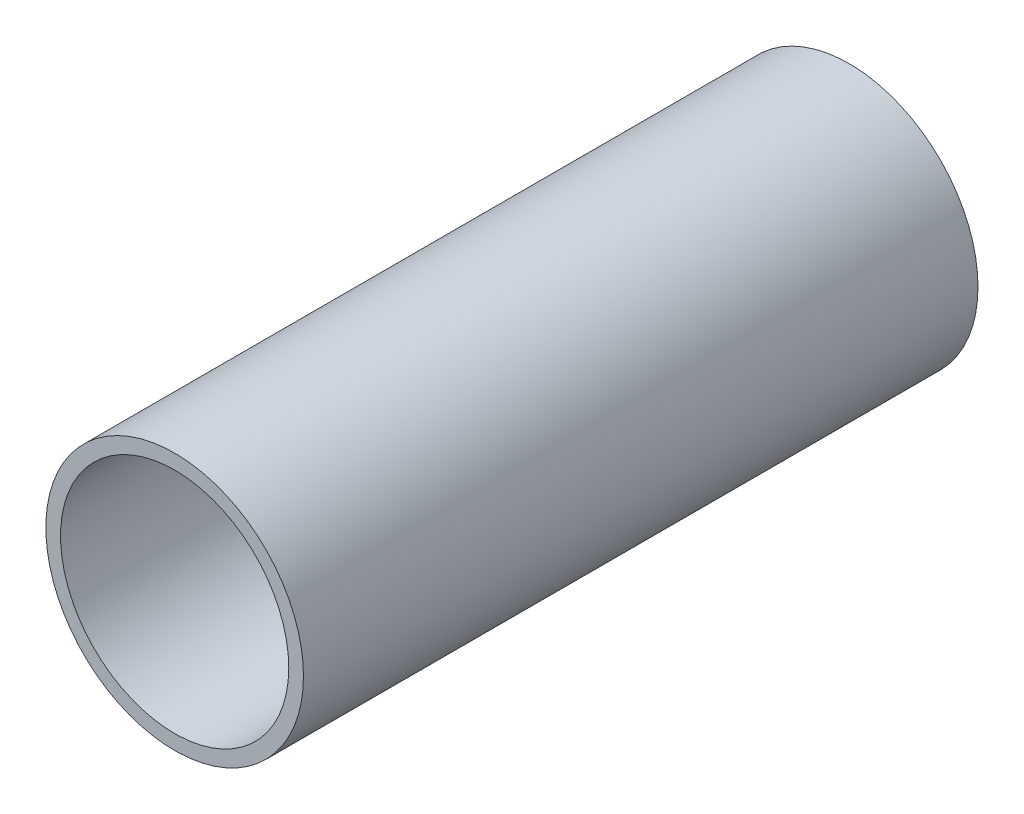
ISO-10303-21;
HEADER;
FILE_DESCRIPTION(('STEP AP214'),'2;1');
FILE_NAME('part.step','',(''),(''),'','','');
FILE_SCHEMA(('AUTOMOTIVE_DESIGN { 1 0 10303 214 1 1 1 1 }'));
ENDSEC;
DATA;
#1=APPLICATION_CONTEXT('core data for automotive mechanical design processes');
#2=APPLICATION_PROTOCOL_DEFINITION('international standard','automotive_design',2000,#1);
#3=PRODUCT_CONTEXT('',#1,'mechanical');
#4=PRODUCT('Part','Part','',(#3));
#5=PRODUCT_RELATED_PRODUCT_CATEGORY('part','',(#4));
#6=PRODUCT_DEFINITION_FORMATION('','',#4);
#7=PRODUCT_DEFINITION_CONTEXT('part definition',#1,'design');
#8=PRODUCT_DEFINITION('design','',#6,#7);
#9=PRODUCT_DEFINITION_SHAPE('','',#8);
#10=(LENGTH_UNIT() NAMED_UNIT(*) SI_UNIT(.MILLI.,.METRE.));
#11=(NAMED_UNIT(*) PLANE_ANGLE_UNIT() SI_UNIT($,.RADIAN.));
#12=(NAMED_UNIT(*) SI_UNIT($,.STERADIAN.) SOLID_ANGLE_UNIT());
#13=UNCERTAINTY_MEASURE_WITH_UNIT(LENGTH_MEASURE(1.E-05),#10,'distance_accuracy_value','');
#14=(GEOMETRIC_REPRESENTATION_CONTEXT(3) GLOBAL_UNCERTAINTY_ASSIGNED_CONTEXT((#13)) GLOBAL_UNIT_ASSIGNED_CONTEXT((#10,
#11,#12)) REPRESENTATION_CONTEXT('',''));
#15=CARTESIAN_POINT('',(0.,0.,0.));
#16=DIRECTION('',(0.,0.,1.));
#17=DIRECTION('',(1.,0.,0.));
#18=AXIS2_PLACEMENT_3D('',#15,#16,#17);
#19=CARTESIAN_POINT('',(0.,0.,298.5));
#20=DIRECTION('',(0.,0.,1.));
#21=DIRECTION('',(1.,0.,0.));
#22=AXIS2_PLACEMENT_3D('',#19,#20,#21);
#23=PLANE('',#22);
#24=CARTESIAN_POINT('',(0.,0.,298.5));
#25=DIRECTION('',(0.,0.,1.));
#26=DIRECTION('',(1.,0.,0.));
#27=AXIS2_PLACEMENT_3D('',#24,#25,#26);
#28=CIRCLE('',#27,57.);
#29=CARTESIAN_POINT('',(57.,0.,298.5));
#30=VERTEX_POINT('',#29);
#31=EDGE_CURVE('E10',#30,#30,#28,.T.);
#32=ORIENTED_EDGE('',*,*,#31,.T.);
#33=EDGE_LOOP('',(#32));
#34=FACE_BOUND('',#33,.T.);
#35=CARTESIAN_POINT('',(0.,0.,298.5));
#36=DIRECTION('',(0.,0.,1.));
#37=DIRECTION('',(1.,0.,0.));
#38=AXIS2_PLACEMENT_3D('',#35,#36,#37);
#39=CIRCLE('',#38,50.5);
#40=CARTESIAN_POINT('',(50.5,0.,298.5));
#41=VERTEX_POINT('',#40);
#42=EDGE_CURVE('E41',#41,#41,#39,.T.);
#43=ORIENTED_EDGE('',*,*,#42,.F.);
#44=EDGE_LOOP('',(#43));
#45=FACE_BOUND('',#44,.T.);
#46=ADVANCED_FACE('F30',(#34,#45),#23,.T.);
#47=CARTESIAN_POINT('',(0.,0.,0.));
#48=DIRECTION('',(0.,0.,1.));
#49=DIRECTION('',(1.,0.,0.));
#50=AXIS2_PLACEMENT_3D('',#47,#48,#49);
#51=PLANE('',#50);
#52=CARTESIAN_POINT('',(0.,0.,0.));
#53=DIRECTION('',(0.,0.,1.));
#54=DIRECTION('',(1.,0.,0.));
#55=AXIS2_PLACEMENT_3D('',#52,#53,#54);
#56=CIRCLE('',#55,57.);
#57=CARTESIAN_POINT('',(57.,0.,0.));
#58=VERTEX_POINT('',#57);
#59=EDGE_CURVE('E34',#58,#58,#56,.T.);
#60=ORIENTED_EDGE('',*,*,#59,.F.);
#61=EDGE_LOOP('',(#60));
#62=FACE_BOUND('',#61,.T.);
#63=CARTESIAN_POINT('',(0.,0.,0.));
#64=DIRECTION('',(0.,0.,1.));
#65=DIRECTION('',(1.,0.,0.));
#66=AXIS2_PLACEMENT_3D('',#63,#64,#65);
#67=CIRCLE('',#66,50.5);
#68=CARTESIAN_POINT('',(50.5,0.,0.));
#69=VERTEX_POINT('',#68);
#70=EDGE_CURVE('E43',#69,#69,#67,.T.);
#71=ORIENTED_EDGE('',*,*,#70,.T.);
#72=EDGE_LOOP('',(#71));
#73=FACE_BOUND('',#72,.T.);
#74=ADVANCED_FACE('F53',(#62,#73),#51,.F.);
#75=CARTESIAN_POINT('',(0.,0.,298.5));
#76=DIRECTION('',(0.,0.,-1.));
#77=DIRECTION('',(-1.,0.,0.));
#78=AXIS2_PLACEMENT_3D('',#75,#76,#77);
#79=CYLINDRICAL_SURFACE('',#78,57.);
#80=ORIENTED_EDGE('',*,*,#31,.F.);
#81=EDGE_LOOP('',(#80));
#82=FACE_BOUND('',#81,.T.);
#83=ORIENTED_EDGE('',*,*,#59,.T.);
#84=EDGE_LOOP('',(#83));
#85=FACE_BOUND('',#84,.T.);
#86=ADVANCED_FACE('F32',(#82,#85),#79,.T.);
#87=CARTESIAN_POINT('',(0.,0.,298.5));
#88=DIRECTION('',(0.,0.,-1.));
#89=DIRECTION('',(-1.,0.,0.));
#90=AXIS2_PLACEMENT_3D('',#87,#88,#89);
#91=CYLINDRICAL_SURFACE('',#90,50.5);
#92=ORIENTED_EDGE('',*,*,#42,.T.);
#93=EDGE_LOOP('',(#92));
#94=FACE_BOUND('',#93,.T.);
#95=ORIENTED_EDGE('',*,*,#70,.F.);
#96=EDGE_LOOP('',(#95));
#97=FACE_BOUND('',#96,.T.);
#98=ADVANCED_FACE('F49',(#94,#97),#91,.F.);
#99=CLOSED_SHELL('',(#46,#74,#86,#98));
#100=MANIFOLD_SOLID_BREP('B2',#99);
#101=ADVANCED_BREP_SHAPE_REPRESENTATION('',(#18,#100),#14);
#102=SHAPE_DEFINITION_REPRESENTATION(#9,#101);
ENDSEC;
END-ISO-10303-21;
